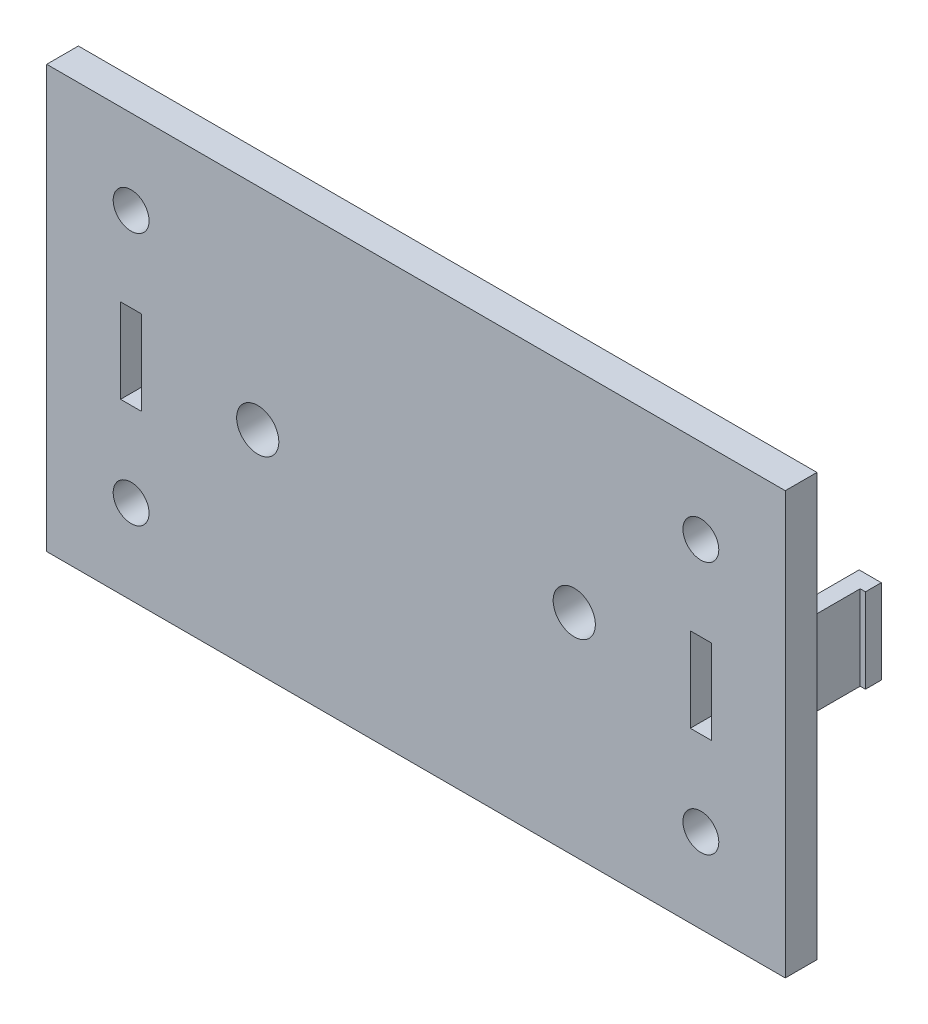
ISO-10303-21;
HEADER;
FILE_DESCRIPTION(('STEP AP214'),'2;1');
FILE_NAME('part.step','',(''),(''),'','','');
FILE_SCHEMA(('AUTOMOTIVE_DESIGN { 1 0 10303 214 1 1 1 1 }'));
ENDSEC;
DATA;
#1=APPLICATION_CONTEXT('core data for automotive mechanical design processes');
#2=APPLICATION_PROTOCOL_DEFINITION('international standard','automotive_design',2000,#1);
#3=PRODUCT_CONTEXT('',#1,'mechanical');
#4=PRODUCT('Part','Part','',(#3));
#5=PRODUCT_RELATED_PRODUCT_CATEGORY('part','',(#4));
#6=PRODUCT_DEFINITION_FORMATION('','',#4);
#7=PRODUCT_DEFINITION_CONTEXT('part definition',#1,'design');
#8=PRODUCT_DEFINITION('design','',#6,#7);
#9=PRODUCT_DEFINITION_SHAPE('','',#8);
#10=(LENGTH_UNIT() NAMED_UNIT(*) SI_UNIT(.MILLI.,.METRE.));
#11=(NAMED_UNIT(*) PLANE_ANGLE_UNIT() SI_UNIT($,.RADIAN.));
#12=(NAMED_UNIT(*) SI_UNIT($,.STERADIAN.) SOLID_ANGLE_UNIT());
#13=UNCERTAINTY_MEASURE_WITH_UNIT(LENGTH_MEASURE(1.E-05),#10,'distance_accuracy_value','');
#14=(GEOMETRIC_REPRESENTATION_CONTEXT(3) GLOBAL_UNCERTAINTY_ASSIGNED_CONTEXT((#13)) GLOBAL_UNIT_ASSIGNED_CONTEXT((#10,
#11,#12)) REPRESENTATION_CONTEXT('',''));
#15=CARTESIAN_POINT('',(0.,0.,0.));
#16=DIRECTION('',(0.,0.,1.));
#17=DIRECTION('',(1.,0.,0.));
#18=AXIS2_PLACEMENT_3D('',#15,#16,#17);
#19=CARTESIAN_POINT('',(0.,0.,0.));
#20=DIRECTION('',(0.,0.,-1.));
#21=DIRECTION('',(-1.,0.,0.));
#22=AXIS2_PLACEMENT_3D('',#19,#20,#21);
#23=PLANE('',#22);
#24=CARTESIAN_POINT('',(27.,12.,0.));
#25=DIRECTION('',(0.,0.,1.));
#26=DIRECTION('',(1.,0.,0.));
#27=AXIS2_PLACEMENT_3D('',#24,#25,#26);
#28=CIRCLE('',#27,1.7);
#29=CARTESIAN_POINT('',(28.7,12.,0.));
#30=VERTEX_POINT('',#29);
#31=EDGE_CURVE('E367',#30,#30,#28,.T.);
#32=ORIENTED_EDGE('',*,*,#31,.T.);
#33=EDGE_LOOP('',(#32));
#34=FACE_BOUND('',#33,.T.);
#35=CARTESIAN_POINT('',(27.,-12.,0.));
#36=DIRECTION('',(0.,0.,1.));
#37=DIRECTION('',(1.,0.,0.));
#38=AXIS2_PLACEMENT_3D('',#35,#36,#37);
#39=CIRCLE('',#38,1.7);
#40=CARTESIAN_POINT('',(28.7,-12.,0.));
#41=VERTEX_POINT('',#40);
#42=EDGE_CURVE('E371',#41,#41,#39,.T.);
#43=ORIENTED_EDGE('',*,*,#42,.T.);
#44=EDGE_LOOP('',(#43));
#45=FACE_BOUND('',#44,.T.);
#46=CARTESIAN_POINT('',(-27.,12.,0.));
#47=DIRECTION('',(0.,0.,1.));
#48=DIRECTION('',(1.,0.,0.));
#49=AXIS2_PLACEMENT_3D('',#46,#47,#48);
#50=CIRCLE('',#49,1.7);
#51=CARTESIAN_POINT('',(-25.3,12.,0.));
#52=VERTEX_POINT('',#51);
#53=EDGE_CURVE('E377',#52,#52,#50,.T.);
#54=ORIENTED_EDGE('',*,*,#53,.T.);
#55=EDGE_LOOP('',(#54));
#56=FACE_BOUND('',#55,.T.);
#57=CARTESIAN_POINT('',(-27.,-12.,0.));
#58=DIRECTION('',(0.,0.,1.));
#59=DIRECTION('',(1.,0.,0.));
#60=AXIS2_PLACEMENT_3D('',#57,#58,#59);
#61=CIRCLE('',#60,1.7);
#62=CARTESIAN_POINT('',(-25.3,-12.,0.));
#63=VERTEX_POINT('',#62);
#64=EDGE_CURVE('E383',#63,#63,#61,.T.);
#65=ORIENTED_EDGE('',*,*,#64,.T.);
#66=EDGE_LOOP('',(#65));
#67=FACE_BOUND('',#66,.T.);
#68=CARTESIAN_POINT('',(15.,0.,0.));
#69=DIRECTION('',(0.,0.,1.));
#70=DIRECTION('',(1.,0.,0.));
#71=AXIS2_PLACEMENT_3D('',#68,#69,#70);
#72=CIRCLE('',#71,2.);
#73=CARTESIAN_POINT('',(17.,0.,0.));
#74=VERTEX_POINT('',#73);
#75=EDGE_CURVE('E389',#74,#74,#72,.T.);
#76=ORIENTED_EDGE('',*,*,#75,.T.);
#77=EDGE_LOOP('',(#76));
#78=FACE_BOUND('',#77,.T.);
#79=CARTESIAN_POINT('',(-15.,0.,0.));
#80=DIRECTION('',(0.,0.,1.));
#81=DIRECTION('',(1.,0.,0.));
#82=AXIS2_PLACEMENT_3D('',#79,#80,#81);
#83=CIRCLE('',#82,2.);
#84=CARTESIAN_POINT('',(-13.,0.,0.));
#85=VERTEX_POINT('',#84);
#86=EDGE_CURVE('E395',#85,#85,#83,.T.);
#87=ORIENTED_EDGE('',*,*,#86,.T.);
#88=EDGE_LOOP('',(#87));
#89=FACE_BOUND('',#88,.T.);
#90=DIRECTION('',(0.,-1.,0.));
#91=VECTOR('',#90,1.);
#92=CARTESIAN_POINT('',(-35.,-20.,0.));
#93=LINE('',#92,#91);
#94=CARTESIAN_POINT('',(-35.,20.,0.));
#95=VERTEX_POINT('',#94);
#96=CARTESIAN_POINT('',(-35.,-20.,0.));
#97=VERTEX_POINT('',#96);
#98=EDGE_CURVE('E401',#95,#97,#93,.T.);
#99=ORIENTED_EDGE('',*,*,#98,.F.);
#100=DIRECTION('',(-1.,0.,0.));
#101=VECTOR('',#100,1.);
#102=CARTESIAN_POINT('',(-35.,20.,0.));
#103=LINE('',#102,#101);
#104=CARTESIAN_POINT('',(35.,20.,0.));
#105=VERTEX_POINT('',#104);
#106=EDGE_CURVE('E408',#105,#95,#103,.T.);
#107=ORIENTED_EDGE('',*,*,#106,.F.);
#108=DIRECTION('',(0.,1.,0.));
#109=VECTOR('',#108,1.);
#110=CARTESIAN_POINT('',(35.,-20.,0.));
#111=LINE('',#110,#109);
#112=CARTESIAN_POINT('',(35.,-20.,0.));
#113=VERTEX_POINT('',#112);
#114=EDGE_CURVE('E419',#113,#105,#111,.T.);
#115=ORIENTED_EDGE('',*,*,#114,.F.);
#116=DIRECTION('',(1.,0.,0.));
#117=VECTOR('',#116,1.);
#118=CARTESIAN_POINT('',(-35.,-20.,0.));
#119=LINE('',#118,#117);
#120=EDGE_CURVE('E417',#97,#113,#119,.T.);
#121=ORIENTED_EDGE('',*,*,#120,.F.);
#122=EDGE_LOOP('',(#99,#107,#115,#121));
#123=FACE_BOUND('',#122,.T.);
#124=DIRECTION('',(-1.,0.,0.));
#125=VECTOR('',#124,1.);
#126=CARTESIAN_POINT('',(-30.6,4.,0.));
#127=LINE('',#126,#125);
#128=CARTESIAN_POINT('',(-29.,4.,0.));
#129=VERTEX_POINT('',#128);
#130=CARTESIAN_POINT('',(-30.6,4.,0.));
#131=VERTEX_POINT('',#130);
#132=EDGE_CURVE('E349',#129,#131,#127,.T.);
#133=ORIENTED_EDGE('',*,*,#132,.T.);
#134=DIRECTION('',(0.,-1.,0.));
#135=VECTOR('',#134,1.);
#136=CARTESIAN_POINT('',(-30.6,-4.,0.));
#137=LINE('',#136,#135);
#138=CARTESIAN_POINT('',(-30.6,-4.,0.));
#139=VERTEX_POINT('',#138);
#140=EDGE_CURVE('E339',#131,#139,#137,.T.);
#141=ORIENTED_EDGE('',*,*,#140,.T.);
#142=DIRECTION('',(1.,0.,0.));
#143=VECTOR('',#142,1.);
#144=CARTESIAN_POINT('',(-30.6,-4.,0.));
#145=LINE('',#144,#143);
#146=CARTESIAN_POINT('',(-29.,-4.,0.));
#147=VERTEX_POINT('',#146);
#148=EDGE_CURVE('E342',#139,#147,#145,.T.);
#149=ORIENTED_EDGE('',*,*,#148,.T.);
#150=DIRECTION('',(0.,1.,0.));
#151=VECTOR('',#150,1.);
#152=CARTESIAN_POINT('',(-29.,-4.,0.));
#153=LINE('',#152,#151);
#154=EDGE_CURVE('E346',#147,#129,#153,.T.);
#155=ORIENTED_EDGE('',*,*,#154,.T.);
#156=EDGE_LOOP('',(#133,#141,#149,#155));
#157=FACE_BOUND('',#156,.T.);
#158=DIRECTION('',(-1.,0.,0.));
#159=VECTOR('',#158,1.);
#160=CARTESIAN_POINT('',(-28.,4.,0.));
#161=LINE('',#160,#159);
#162=CARTESIAN_POINT('',(-26.,4.,0.));
#163=VERTEX_POINT('',#162);
#164=CARTESIAN_POINT('',(-28.,4.,0.));
#165=VERTEX_POINT('',#164);
#166=EDGE_CURVE('E291',#163,#165,#161,.T.);
#167=ORIENTED_EDGE('',*,*,#166,.T.);
#168=DIRECTION('',(0.,-1.,0.));
#169=VECTOR('',#168,1.);
#170=CARTESIAN_POINT('',(-28.,-4.,0.));
#171=LINE('',#170,#169);
#172=CARTESIAN_POINT('',(-28.,-4.,0.));
#173=VERTEX_POINT('',#172);
#174=EDGE_CURVE('E287',#165,#173,#171,.T.);
#175=ORIENTED_EDGE('',*,*,#174,.T.);
#176=DIRECTION('',(1.,0.,0.));
#177=VECTOR('',#176,1.);
#178=CARTESIAN_POINT('',(-28.,-4.,0.));
#179=LINE('',#178,#177);
#180=CARTESIAN_POINT('',(-26.,-4.,0.));
#181=VERTEX_POINT('',#180);
#182=EDGE_CURVE('E301',#173,#181,#179,.T.);
#183=ORIENTED_EDGE('',*,*,#182,.T.);
#184=DIRECTION('',(0.,1.,0.));
#185=VECTOR('',#184,1.);
#186=CARTESIAN_POINT('',(-26.,-4.,0.));
#187=LINE('',#186,#185);
#188=EDGE_CURVE('E304',#181,#163,#187,.T.);
#189=ORIENTED_EDGE('',*,*,#188,.T.);
#190=EDGE_LOOP('',(#167,#175,#183,#189));
#191=FACE_BOUND('',#190,.T.);
#192=DIRECTION('',(-1.,0.,0.));
#193=VECTOR('',#192,1.);
#194=CARTESIAN_POINT('',(29.,4.,0.));
#195=LINE('',#194,#193);
#196=CARTESIAN_POINT('',(30.6,4.,0.));
#197=VERTEX_POINT('',#196);
#198=CARTESIAN_POINT('',(29.,4.,0.));
#199=VERTEX_POINT('',#198);
#200=EDGE_CURVE('E268',#197,#199,#195,.T.);
#201=ORIENTED_EDGE('',*,*,#200,.T.);
#202=DIRECTION('',(0.,-1.,0.));
#203=VECTOR('',#202,1.);
#204=CARTESIAN_POINT('',(29.,-4.,0.));
#205=LINE('',#204,#203);
#206=CARTESIAN_POINT('',(29.,-4.,0.));
#207=VERTEX_POINT('',#206);
#208=EDGE_CURVE('E258',#199,#207,#205,.T.);
#209=ORIENTED_EDGE('',*,*,#208,.T.);
#210=DIRECTION('',(1.,0.,0.));
#211=VECTOR('',#210,1.);
#212=CARTESIAN_POINT('',(29.,-4.,0.));
#213=LINE('',#212,#211);
#214=CARTESIAN_POINT('',(30.6,-4.,0.));
#215=VERTEX_POINT('',#214);
#216=EDGE_CURVE('E261',#207,#215,#213,.T.);
#217=ORIENTED_EDGE('',*,*,#216,.T.);
#218=DIRECTION('',(0.,1.,0.));
#219=VECTOR('',#218,1.);
#220=CARTESIAN_POINT('',(30.6,-4.,0.));
#221=LINE('',#220,#219);
#222=EDGE_CURVE('E265',#215,#197,#221,.T.);
#223=ORIENTED_EDGE('',*,*,#222,.T.);
#224=EDGE_LOOP('',(#201,#209,#217,#223));
#225=FACE_BOUND('',#224,.T.);
#226=DIRECTION('',(-1.,0.,0.));
#227=VECTOR('',#226,1.);
#228=CARTESIAN_POINT('',(26.,4.,0.));
#229=LINE('',#228,#227);
#230=CARTESIAN_POINT('',(28.,4.,0.));
#231=VERTEX_POINT('',#230);
#232=CARTESIAN_POINT('',(26.,4.,0.));
#233=VERTEX_POINT('',#232);
#234=EDGE_CURVE('E211',#231,#233,#229,.T.);
#235=ORIENTED_EDGE('',*,*,#234,.T.);
#236=DIRECTION('',(0.,-1.,0.));
#237=VECTOR('',#236,1.);
#238=CARTESIAN_POINT('',(26.,-4.,0.));
#239=LINE('',#238,#237);
#240=CARTESIAN_POINT('',(26.,-4.,0.));
#241=VERTEX_POINT('',#240);
#242=EDGE_CURVE('E56',#233,#241,#239,.T.);
#243=ORIENTED_EDGE('',*,*,#242,.T.);
#244=DIRECTION('',(1.,0.,0.));
#245=VECTOR('',#244,1.);
#246=CARTESIAN_POINT('',(26.,-4.,0.));
#247=LINE('',#246,#245);
#248=CARTESIAN_POINT('',(28.,-4.,0.));
#249=VERTEX_POINT('',#248);
#250=EDGE_CURVE('E217',#241,#249,#247,.T.);
#251=ORIENTED_EDGE('',*,*,#250,.T.);
#252=DIRECTION('',(0.,1.,0.));
#253=VECTOR('',#252,1.);
#254=CARTESIAN_POINT('',(28.,-4.,0.));
#255=LINE('',#254,#253);
#256=EDGE_CURVE('E231',#249,#231,#255,.T.);
#257=ORIENTED_EDGE('',*,*,#256,.T.);
#258=EDGE_LOOP('',(#235,#243,#251,#257));
#259=FACE_BOUND('',#258,.T.);
#260=ADVANCED_FACE('F41',(#34,#45,#56,#67,#78,#89,#123,#157,#191,#225,#259),#23,.T.);
#261=CARTESIAN_POINT('',(0.,0.,3.));
#262=DIRECTION('',(0.,0.,-1.));
#263=DIRECTION('',(-1.,0.,0.));
#264=AXIS2_PLACEMENT_3D('',#261,#262,#263);
#265=PLANE('',#264);
#266=DIRECTION('',(0.,-1.,0.));
#267=VECTOR('',#266,1.);
#268=CARTESIAN_POINT('',(-28.,-4.,3.));
#269=LINE('',#268,#267);
#270=CARTESIAN_POINT('',(-28.,4.,3.));
#271=VERTEX_POINT('',#270);
#272=CARTESIAN_POINT('',(-28.,-4.,3.));
#273=VERTEX_POINT('',#272);
#274=EDGE_CURVE('E288',#271,#273,#269,.T.);
#275=ORIENTED_EDGE('',*,*,#274,.F.);
#276=DIRECTION('',(-1.,0.,0.));
#277=VECTOR('',#276,1.);
#278=CARTESIAN_POINT('',(-28.,4.,3.));
#279=LINE('',#278,#277);
#280=CARTESIAN_POINT('',(-26.,4.,3.));
#281=VERTEX_POINT('',#280);
#282=EDGE_CURVE('E296',#281,#271,#279,.T.);
#283=ORIENTED_EDGE('',*,*,#282,.F.);
#284=DIRECTION('',(0.,1.,0.));
#285=VECTOR('',#284,1.);
#286=CARTESIAN_POINT('',(-26.,-4.,3.));
#287=LINE('',#286,#285);
#288=CARTESIAN_POINT('',(-26.,-4.,3.));
#289=VERTEX_POINT('',#288);
#290=EDGE_CURVE('E293',#289,#281,#287,.T.);
#291=ORIENTED_EDGE('',*,*,#290,.F.);
#292=DIRECTION('',(1.,0.,0.));
#293=VECTOR('',#292,1.);
#294=CARTESIAN_POINT('',(-28.,-4.,3.));
#295=LINE('',#294,#293);
#296=EDGE_CURVE('E290',#273,#289,#295,.T.);
#297=ORIENTED_EDGE('',*,*,#296,.F.);
#298=EDGE_LOOP('',(#275,#283,#291,#297));
#299=FACE_BOUND('',#298,.T.);
#300=CARTESIAN_POINT('',(27.,12.,3.));
#301=DIRECTION('',(0.,0.,1.));
#302=DIRECTION('',(1.,0.,0.));
#303=AXIS2_PLACEMENT_3D('',#300,#301,#302);
#304=CIRCLE('',#303,1.7);
#305=CARTESIAN_POINT('',(28.7,12.,3.));
#306=VERTEX_POINT('',#305);
#307=EDGE_CURVE('E368',#306,#306,#304,.T.);
#308=ORIENTED_EDGE('',*,*,#307,.F.);
#309=EDGE_LOOP('',(#308));
#310=FACE_BOUND('',#309,.T.);
#311=CARTESIAN_POINT('',(27.,-12.,3.));
#312=DIRECTION('',(0.,0.,1.));
#313=DIRECTION('',(1.,0.,0.));
#314=AXIS2_PLACEMENT_3D('',#311,#312,#313);
#315=CIRCLE('',#314,1.7);
#316=CARTESIAN_POINT('',(28.7,-12.,3.));
#317=VERTEX_POINT('',#316);
#318=EDGE_CURVE('E374',#317,#317,#315,.T.);
#319=ORIENTED_EDGE('',*,*,#318,.F.);
#320=EDGE_LOOP('',(#319));
#321=FACE_BOUND('',#320,.T.);
#322=CARTESIAN_POINT('',(-27.,12.,3.));
#323=DIRECTION('',(0.,0.,1.));
#324=DIRECTION('',(1.,0.,0.));
#325=AXIS2_PLACEMENT_3D('',#322,#323,#324);
#326=CIRCLE('',#325,1.7);
#327=CARTESIAN_POINT('',(-25.3,12.,3.));
#328=VERTEX_POINT('',#327);
#329=EDGE_CURVE('E380',#328,#328,#326,.T.);
#330=ORIENTED_EDGE('',*,*,#329,.F.);
#331=EDGE_LOOP('',(#330));
#332=FACE_BOUND('',#331,.T.);
#333=CARTESIAN_POINT('',(-27.,-12.,3.));
#334=DIRECTION('',(0.,0.,1.));
#335=DIRECTION('',(1.,0.,0.));
#336=AXIS2_PLACEMENT_3D('',#333,#334,#335);
#337=CIRCLE('',#336,1.7);
#338=CARTESIAN_POINT('',(-25.3,-12.,3.));
#339=VERTEX_POINT('',#338);
#340=EDGE_CURVE('E386',#339,#339,#337,.T.);
#341=ORIENTED_EDGE('',*,*,#340,.F.);
#342=EDGE_LOOP('',(#341));
#343=FACE_BOUND('',#342,.T.);
#344=CARTESIAN_POINT('',(15.,0.,3.));
#345=DIRECTION('',(0.,0.,1.));
#346=DIRECTION('',(1.,0.,0.));
#347=AXIS2_PLACEMENT_3D('',#344,#345,#346);
#348=CIRCLE('',#347,2.);
#349=CARTESIAN_POINT('',(17.,0.,3.));
#350=VERTEX_POINT('',#349);
#351=EDGE_CURVE('E392',#350,#350,#348,.T.);
#352=ORIENTED_EDGE('',*,*,#351,.F.);
#353=EDGE_LOOP('',(#352));
#354=FACE_BOUND('',#353,.T.);
#355=CARTESIAN_POINT('',(-15.,0.,3.));
#356=DIRECTION('',(0.,0.,1.));
#357=DIRECTION('',(1.,0.,0.));
#358=AXIS2_PLACEMENT_3D('',#355,#356,#357);
#359=CIRCLE('',#358,2.);
#360=CARTESIAN_POINT('',(-13.,0.,3.));
#361=VERTEX_POINT('',#360);
#362=EDGE_CURVE('E398',#361,#361,#359,.T.);
#363=ORIENTED_EDGE('',*,*,#362,.F.);
#364=EDGE_LOOP('',(#363));
#365=FACE_BOUND('',#364,.T.);
#366=DIRECTION('',(0.,-1.,0.));
#367=VECTOR('',#366,1.);
#368=CARTESIAN_POINT('',(-35.,-20.,3.));
#369=LINE('',#368,#367);
#370=CARTESIAN_POINT('',(-35.,20.,3.));
#371=VERTEX_POINT('',#370);
#372=CARTESIAN_POINT('',(-35.,-20.,3.));
#373=VERTEX_POINT('',#372);
#374=EDGE_CURVE('E404',#371,#373,#369,.T.);
#375=ORIENTED_EDGE('',*,*,#374,.T.);
#376=DIRECTION('',(1.,0.,0.));
#377=VECTOR('',#376,1.);
#378=CARTESIAN_POINT('',(-35.,-20.,3.));
#379=LINE('',#378,#377);
#380=CARTESIAN_POINT('',(35.,-20.,3.));
#381=VERTEX_POINT('',#380);
#382=EDGE_CURVE('E407',#373,#381,#379,.T.);
#383=ORIENTED_EDGE('',*,*,#382,.T.);
#384=DIRECTION('',(0.,1.,0.));
#385=VECTOR('',#384,1.);
#386=CARTESIAN_POINT('',(35.,-20.,3.));
#387=LINE('',#386,#385);
#388=CARTESIAN_POINT('',(35.,20.,3.));
#389=VERTEX_POINT('',#388);
#390=EDGE_CURVE('E410',#381,#389,#387,.T.);
#391=ORIENTED_EDGE('',*,*,#390,.T.);
#392=DIRECTION('',(-1.,0.,0.));
#393=VECTOR('',#392,1.);
#394=CARTESIAN_POINT('',(-35.,20.,3.));
#395=LINE('',#394,#393);
#396=EDGE_CURVE('E412',#389,#371,#395,.T.);
#397=ORIENTED_EDGE('',*,*,#396,.T.);
#398=EDGE_LOOP('',(#375,#383,#391,#397));
#399=FACE_BOUND('',#398,.T.);
#400=DIRECTION('',(0.,-1.,0.));
#401=VECTOR('',#400,1.);
#402=CARTESIAN_POINT('',(26.,-4.,3.));
#403=LINE('',#402,#401);
#404=CARTESIAN_POINT('',(26.,4.,3.));
#405=VERTEX_POINT('',#404);
#406=CARTESIAN_POINT('',(26.,-4.,3.));
#407=VERTEX_POINT('',#406);
#408=EDGE_CURVE('E202',#405,#407,#403,.T.);
#409=ORIENTED_EDGE('',*,*,#408,.F.);
#410=DIRECTION('',(-1.,0.,0.));
#411=VECTOR('',#410,1.);
#412=CARTESIAN_POINT('',(26.,4.,3.));
#413=LINE('',#412,#411);
#414=CARTESIAN_POINT('',(28.,4.,3.));
#415=VERTEX_POINT('',#414);
#416=EDGE_CURVE('E225',#415,#405,#413,.T.);
#417=ORIENTED_EDGE('',*,*,#416,.F.);
#418=DIRECTION('',(0.,1.,0.));
#419=VECTOR('',#418,1.);
#420=CARTESIAN_POINT('',(28.,-4.,3.));
#421=LINE('',#420,#419);
#422=CARTESIAN_POINT('',(28.,-4.,3.));
#423=VERTEX_POINT('',#422);
#424=EDGE_CURVE('E223',#423,#415,#421,.T.);
#425=ORIENTED_EDGE('',*,*,#424,.F.);
#426=DIRECTION('',(1.,0.,0.));
#427=VECTOR('',#426,1.);
#428=CARTESIAN_POINT('',(26.,-4.,3.));
#429=LINE('',#428,#427);
#430=EDGE_CURVE('E210',#407,#423,#429,.T.);
#431=ORIENTED_EDGE('',*,*,#430,.F.);
#432=EDGE_LOOP('',(#409,#417,#425,#431));
#433=FACE_BOUND('',#432,.T.);
#434=ADVANCED_FACE('F222',(#299,#310,#321,#332,#343,#354,#365,#399,#433),#265,.F.);
#435=CARTESIAN_POINT('',(30.6,-4.,0.));
#436=DIRECTION('',(-1.,0.,0.));
#437=DIRECTION('',(0.,0.,1.));
#438=AXIS2_PLACEMENT_3D('',#435,#436,#437);
#439=PLANE('',#438);
#440=DIRECTION('',(0.,-1.,0.));
#441=VECTOR('',#440,1.);
#442=CARTESIAN_POINT('',(30.6,-4.,-8.5));
#443=LINE('',#442,#441);
#444=CARTESIAN_POINT('',(30.6,4.,-8.5));
#445=VERTEX_POINT('',#444);
#446=CARTESIAN_POINT('',(30.6,-4.,-8.5));
#447=VERTEX_POINT('',#446);
#448=EDGE_CURVE('E239',#445,#447,#443,.T.);
#449=ORIENTED_EDGE('',*,*,#448,.F.);
#450=DIRECTION('',(0.,0.,-1.));
#451=VECTOR('',#450,1.);
#452=CARTESIAN_POINT('',(30.6,4.,0.));
#453=LINE('',#452,#451);
#454=EDGE_CURVE('E279',#197,#445,#453,.T.);
#455=ORIENTED_EDGE('',*,*,#454,.F.);
#456=ORIENTED_EDGE('',*,*,#222,.F.);
#457=DIRECTION('',(0.,0.,-1.));
#458=VECTOR('',#457,1.);
#459=CARTESIAN_POINT('',(30.6,-4.,0.));
#460=LINE('',#459,#458);
#461=EDGE_CURVE('E282',#215,#447,#460,.T.);
#462=ORIENTED_EDGE('',*,*,#461,.T.);
#463=EDGE_LOOP('',(#449,#455,#456,#462));
#464=FACE_BOUND('',#463,.T.);
#465=ADVANCED_FACE('F461',(#464),#439,.F.);
#466=CARTESIAN_POINT('',(-30.6,-4.,0.));
#467=DIRECTION('',(1.,0.,0.));
#468=DIRECTION('',(0.,0.,-1.));
#469=AXIS2_PLACEMENT_3D('',#466,#467,#468);
#470=PLANE('',#469);
#471=DIRECTION('',(0.,1.,0.));
#472=VECTOR('',#471,1.);
#473=CARTESIAN_POINT('',(-30.6,-4.,-8.5));
#474=LINE('',#473,#472);
#475=CARTESIAN_POINT('',(-30.6,-4.,-8.5));
#476=VERTEX_POINT('',#475);
#477=CARTESIAN_POINT('',(-30.6,4.,-8.5));
#478=VERTEX_POINT('',#477);
#479=EDGE_CURVE('E325',#476,#478,#474,.T.);
#480=ORIENTED_EDGE('',*,*,#479,.F.);
#481=DIRECTION('',(0.,0.,-1.));
#482=VECTOR('',#481,1.);
#483=CARTESIAN_POINT('',(-30.6,-4.,0.));
#484=LINE('',#483,#482);
#485=EDGE_CURVE('E364',#139,#476,#484,.T.);
#486=ORIENTED_EDGE('',*,*,#485,.F.);
#487=ORIENTED_EDGE('',*,*,#140,.F.);
#488=DIRECTION('',(0.,0.,-1.));
#489=VECTOR('',#488,1.);
#490=CARTESIAN_POINT('',(-30.6,4.,0.));
#491=LINE('',#490,#489);
#492=EDGE_CURVE('E352',#131,#478,#491,.T.);
#493=ORIENTED_EDGE('',*,*,#492,.T.);
#494=EDGE_LOOP('',(#480,#486,#487,#493));
#495=FACE_BOUND('',#494,.T.);
#496=ADVANCED_FACE('F453',(#495),#470,.F.);
#497=CARTESIAN_POINT('',(-35.,-20.,3.));
#498=DIRECTION('',(1.,0.,0.));
#499=DIRECTION('',(0.,0.,-1.));
#500=AXIS2_PLACEMENT_3D('',#497,#498,#499);
#501=PLANE('',#500);
#502=ORIENTED_EDGE('',*,*,#98,.T.);
#503=DIRECTION('',(0.,0.,-1.));
#504=VECTOR('',#503,1.);
#505=CARTESIAN_POINT('',(-35.,-20.,3.));
#506=LINE('',#505,#504);
#507=EDGE_CURVE('E11',#373,#97,#506,.T.);
#508=ORIENTED_EDGE('',*,*,#507,.F.);
#509=ORIENTED_EDGE('',*,*,#374,.F.);
#510=DIRECTION('',(0.,0.,-1.));
#511=VECTOR('',#510,1.);
#512=CARTESIAN_POINT('',(-35.,20.,3.));
#513=LINE('',#512,#511);
#514=EDGE_CURVE('E414',#371,#95,#513,.T.);
#515=ORIENTED_EDGE('',*,*,#514,.T.);
#516=EDGE_LOOP('',(#502,#508,#509,#515));
#517=FACE_BOUND('',#516,.T.);
#518=ADVANCED_FACE('F43',(#517),#501,.F.);
#519=CARTESIAN_POINT('',(-35.,-20.,3.));
#520=DIRECTION('',(0.,1.,0.));
#521=DIRECTION('',(0.,0.,1.));
#522=AXIS2_PLACEMENT_3D('',#519,#520,#521);
#523=PLANE('',#522);
#524=ORIENTED_EDGE('',*,*,#120,.T.);
#525=DIRECTION('',(0.,0.,-1.));
#526=VECTOR('',#525,1.);
#527=CARTESIAN_POINT('',(35.,-20.,3.));
#528=LINE('',#527,#526);
#529=EDGE_CURVE('E49',#381,#113,#528,.T.);
#530=ORIENTED_EDGE('',*,*,#529,.F.);
#531=ORIENTED_EDGE('',*,*,#382,.F.);
#532=ORIENTED_EDGE('',*,*,#507,.T.);
#533=EDGE_LOOP('',(#524,#530,#531,#532));
#534=FACE_BOUND('',#533,.T.);
#535=ADVANCED_FACE('F446',(#534),#523,.F.);
#536=CARTESIAN_POINT('',(35.,-20.,3.));
#537=DIRECTION('',(-1.,0.,0.));
#538=DIRECTION('',(0.,0.,1.));
#539=AXIS2_PLACEMENT_3D('',#536,#537,#538);
#540=PLANE('',#539);
#541=ORIENTED_EDGE('',*,*,#114,.T.);
#542=DIRECTION('',(0.,0.,-1.));
#543=VECTOR('',#542,1.);
#544=CARTESIAN_POINT('',(35.,20.,3.));
#545=LINE('',#544,#543);
#546=EDGE_CURVE('E424',#389,#105,#545,.T.);
#547=ORIENTED_EDGE('',*,*,#546,.F.);
#548=ORIENTED_EDGE('',*,*,#390,.F.);
#549=ORIENTED_EDGE('',*,*,#529,.T.);
#550=EDGE_LOOP('',(#541,#547,#548,#549));
#551=FACE_BOUND('',#550,.T.);
#552=ADVANCED_FACE('F431',(#551),#540,.F.);
#553=CARTESIAN_POINT('',(-35.,20.,3.));
#554=DIRECTION('',(0.,-1.,0.));
#555=DIRECTION('',(0.,0.,-1.));
#556=AXIS2_PLACEMENT_3D('',#553,#554,#555);
#557=PLANE('',#556);
#558=ORIENTED_EDGE('',*,*,#106,.T.);
#559=ORIENTED_EDGE('',*,*,#514,.F.);
#560=ORIENTED_EDGE('',*,*,#396,.F.);
#561=ORIENTED_EDGE('',*,*,#546,.T.);
#562=EDGE_LOOP('',(#558,#559,#560,#561));
#563=FACE_BOUND('',#562,.T.);
#564=ADVANCED_FACE('F440',(#563),#557,.F.);
#565=CARTESIAN_POINT('',(-15.,0.,3.));
#566=DIRECTION('',(0.,0.,-1.));
#567=DIRECTION('',(-1.,0.,0.));
#568=AXIS2_PLACEMENT_3D('',#565,#566,#567);
#569=CYLINDRICAL_SURFACE('',#568,2.);
#570=ORIENTED_EDGE('',*,*,#362,.T.);
#571=EDGE_LOOP('',(#570));
#572=FACE_BOUND('',#571,.T.);
#573=ORIENTED_EDGE('',*,*,#86,.F.);
#574=EDGE_LOOP('',(#573));
#575=FACE_BOUND('',#574,.T.);
#576=ADVANCED_FACE('F468',(#572,#575),#569,.F.);
#577=CARTESIAN_POINT('',(15.,0.,3.));
#578=DIRECTION('',(0.,0.,-1.));
#579=DIRECTION('',(-1.,0.,0.));
#580=AXIS2_PLACEMENT_3D('',#577,#578,#579);
#581=CYLINDRICAL_SURFACE('',#580,2.);
#582=ORIENTED_EDGE('',*,*,#351,.T.);
#583=EDGE_LOOP('',(#582));
#584=FACE_BOUND('',#583,.T.);
#585=ORIENTED_EDGE('',*,*,#75,.F.);
#586=EDGE_LOOP('',(#585));
#587=FACE_BOUND('',#586,.T.);
#588=ADVANCED_FACE('F472',(#584,#587),#581,.F.);
#589=CARTESIAN_POINT('',(-27.,-12.,3.));
#590=DIRECTION('',(0.,0.,-1.));
#591=DIRECTION('',(-1.,0.,0.));
#592=AXIS2_PLACEMENT_3D('',#589,#590,#591);
#593=CYLINDRICAL_SURFACE('',#592,1.7);
#594=ORIENTED_EDGE('',*,*,#340,.T.);
#595=EDGE_LOOP('',(#594));
#596=FACE_BOUND('',#595,.T.);
#597=ORIENTED_EDGE('',*,*,#64,.F.);
#598=EDGE_LOOP('',(#597));
#599=FACE_BOUND('',#598,.T.);
#600=ADVANCED_FACE('F477',(#596,#599),#593,.F.);
#601=CARTESIAN_POINT('',(-27.,12.,3.));
#602=DIRECTION('',(0.,0.,-1.));
#603=DIRECTION('',(-1.,0.,0.));
#604=AXIS2_PLACEMENT_3D('',#601,#602,#603);
#605=CYLINDRICAL_SURFACE('',#604,1.7);
#606=ORIENTED_EDGE('',*,*,#329,.T.);
#607=EDGE_LOOP('',(#606));
#608=FACE_BOUND('',#607,.T.);
#609=ORIENTED_EDGE('',*,*,#53,.F.);
#610=EDGE_LOOP('',(#609));
#611=FACE_BOUND('',#610,.T.);
#612=ADVANCED_FACE('F484',(#608,#611),#605,.F.);
#613=CARTESIAN_POINT('',(27.,-12.,3.));
#614=DIRECTION('',(0.,0.,-1.));
#615=DIRECTION('',(-1.,0.,0.));
#616=AXIS2_PLACEMENT_3D('',#613,#614,#615);
#617=CYLINDRICAL_SURFACE('',#616,1.7);
#618=ORIENTED_EDGE('',*,*,#318,.T.);
#619=EDGE_LOOP('',(#618));
#620=FACE_BOUND('',#619,.T.);
#621=ORIENTED_EDGE('',*,*,#42,.F.);
#622=EDGE_LOOP('',(#621));
#623=FACE_BOUND('',#622,.T.);
#624=ADVANCED_FACE('F488',(#620,#623),#617,.F.);
#625=CARTESIAN_POINT('',(27.,12.,3.));
#626=DIRECTION('',(0.,0.,-1.));
#627=DIRECTION('',(-1.,0.,0.));
#628=AXIS2_PLACEMENT_3D('',#625,#626,#627);
#629=CYLINDRICAL_SURFACE('',#628,1.7);
#630=ORIENTED_EDGE('',*,*,#307,.T.);
#631=EDGE_LOOP('',(#630));
#632=FACE_BOUND('',#631,.T.);
#633=ORIENTED_EDGE('',*,*,#31,.F.);
#634=EDGE_LOOP('',(#633));
#635=FACE_BOUND('',#634,.T.);
#636=ADVANCED_FACE('F492',(#632,#635),#629,.F.);
#637=CARTESIAN_POINT('',(-30.6,-4.,0.));
#638=DIRECTION('',(0.,1.,0.));
#639=DIRECTION('',(0.,0.,1.));
#640=AXIS2_PLACEMENT_3D('',#637,#638,#639);
#641=PLANE('',#640);
#642=DIRECTION('',(1.,0.,0.));
#643=VECTOR('',#642,1.);
#644=CARTESIAN_POINT('',(-30.6,-4.,-10.));
#645=LINE('',#644,#643);
#646=CARTESIAN_POINT('',(-31.1,-4.,-10.));
#647=VERTEX_POINT('',#646);
#648=CARTESIAN_POINT('',(-29.,-4.,-10.));
#649=VERTEX_POINT('',#648);
#650=EDGE_CURVE('E338',#647,#649,#645,.T.);
#651=ORIENTED_EDGE('',*,*,#650,.T.);
#652=DIRECTION('',(0.,0.,-1.));
#653=VECTOR('',#652,1.);
#654=CARTESIAN_POINT('',(-29.,-4.,0.));
#655=LINE('',#654,#653);
#656=EDGE_CURVE('E361',#147,#649,#655,.T.);
#657=ORIENTED_EDGE('',*,*,#656,.F.);
#658=ORIENTED_EDGE('',*,*,#148,.F.);
#659=ORIENTED_EDGE('',*,*,#485,.T.);
#660=DIRECTION('',(1.,0.,0.));
#661=VECTOR('',#660,1.);
#662=CARTESIAN_POINT('',(-31.1,-4.,-8.5));
#663=LINE('',#662,#661);
#664=CARTESIAN_POINT('',(-31.1,-4.,-8.5));
#665=VERTEX_POINT('',#664);
#666=EDGE_CURVE('E322',#665,#476,#663,.T.);
#667=ORIENTED_EDGE('',*,*,#666,.F.);
#668=DIRECTION('',(0.,0.,-1.));
#669=VECTOR('',#668,1.);
#670=CARTESIAN_POINT('',(-31.1,-4.,-8.5));
#671=LINE('',#670,#669);
#672=EDGE_CURVE('E335',#665,#647,#671,.T.);
#673=ORIENTED_EDGE('',*,*,#672,.T.);
#674=EDGE_LOOP('',(#651,#657,#658,#659,#667,#673));
#675=FACE_BOUND('',#674,.T.);
#676=ADVANCED_FACE('F496',(#675),#641,.F.);
#677=CARTESIAN_POINT('',(-29.,-4.,0.));
#678=DIRECTION('',(-1.,0.,0.));
#679=DIRECTION('',(0.,0.,1.));
#680=AXIS2_PLACEMENT_3D('',#677,#678,#679);
#681=PLANE('',#680);
#682=DIRECTION('',(0.,1.,0.));
#683=VECTOR('',#682,1.);
#684=CARTESIAN_POINT('',(-29.,-4.,-10.));
#685=LINE('',#684,#683);
#686=CARTESIAN_POINT('',(-29.,4.,-10.));
#687=VERTEX_POINT('',#686);
#688=EDGE_CURVE('E354',#649,#687,#685,.T.);
#689=ORIENTED_EDGE('',*,*,#688,.T.);
#690=DIRECTION('',(0.,0.,-1.));
#691=VECTOR('',#690,1.);
#692=CARTESIAN_POINT('',(-29.,4.,0.));
#693=LINE('',#692,#691);
#694=EDGE_CURVE('E358',#129,#687,#693,.T.);
#695=ORIENTED_EDGE('',*,*,#694,.F.);
#696=ORIENTED_EDGE('',*,*,#154,.F.);
#697=ORIENTED_EDGE('',*,*,#656,.T.);
#698=EDGE_LOOP('',(#689,#695,#696,#697));
#699=FACE_BOUND('',#698,.T.);
#700=ADVANCED_FACE('F503',(#699),#681,.F.);
#701=CARTESIAN_POINT('',(-30.6,4.,0.));
#702=DIRECTION('',(0.,-1.,0.));
#703=DIRECTION('',(0.,0.,-1.));
#704=AXIS2_PLACEMENT_3D('',#701,#702,#703);
#705=PLANE('',#704);
#706=DIRECTION('',(-1.,0.,0.));
#707=VECTOR('',#706,1.);
#708=CARTESIAN_POINT('',(-30.6,4.,-10.));
#709=LINE('',#708,#707);
#710=CARTESIAN_POINT('',(-31.1,4.,-10.));
#711=VERTEX_POINT('',#710);
#712=EDGE_CURVE('E343',#687,#711,#709,.T.);
#713=ORIENTED_EDGE('',*,*,#712,.T.);
#714=DIRECTION('',(0.,0.,-1.));
#715=VECTOR('',#714,1.);
#716=CARTESIAN_POINT('',(-31.1,4.,-8.5));
#717=LINE('',#716,#715);
#718=CARTESIAN_POINT('',(-31.1,4.,-8.5));
#719=VERTEX_POINT('',#718);
#720=EDGE_CURVE('E330',#719,#711,#717,.T.);
#721=ORIENTED_EDGE('',*,*,#720,.F.);
#722=DIRECTION('',(-1.,0.,0.));
#723=VECTOR('',#722,1.);
#724=CARTESIAN_POINT('',(-31.1,4.,-8.5));
#725=LINE('',#724,#723);
#726=EDGE_CURVE('E328',#478,#719,#725,.T.);
#727=ORIENTED_EDGE('',*,*,#726,.F.);
#728=ORIENTED_EDGE('',*,*,#492,.F.);
#729=ORIENTED_EDGE('',*,*,#132,.F.);
#730=ORIENTED_EDGE('',*,*,#694,.T.);
#731=EDGE_LOOP('',(#713,#721,#727,#728,#729,#730));
#732=FACE_BOUND('',#731,.T.);
#733=ADVANCED_FACE('F507',(#732),#705,.F.);
#734=CARTESIAN_POINT('',(0.,0.,-10.));
#735=DIRECTION('',(0.,0.,-1.));
#736=DIRECTION('',(-1.,0.,0.));
#737=AXIS2_PLACEMENT_3D('',#734,#735,#736);
#738=PLANE('',#737);
#739=ORIENTED_EDGE('',*,*,#650,.F.);
#740=DIRECTION('',(0.,-1.,0.));
#741=VECTOR('',#740,1.);
#742=CARTESIAN_POINT('',(-31.1,-4.,-10.));
#743=LINE('',#742,#741);
#744=EDGE_CURVE('E318',#711,#647,#743,.T.);
#745=ORIENTED_EDGE('',*,*,#744,.F.);
#746=ORIENTED_EDGE('',*,*,#712,.F.);
#747=ORIENTED_EDGE('',*,*,#688,.F.);
#748=EDGE_LOOP('',(#739,#745,#746,#747));
#749=FACE_BOUND('',#748,.T.);
#750=ADVANCED_FACE('F511',(#749),#738,.T.);
#751=CARTESIAN_POINT('',(-31.1,-4.,-8.5));
#752=DIRECTION('',(1.,0.,0.));
#753=DIRECTION('',(0.,0.,-1.));
#754=AXIS2_PLACEMENT_3D('',#751,#752,#753);
#755=PLANE('',#754);
#756=ORIENTED_EDGE('',*,*,#744,.T.);
#757=ORIENTED_EDGE('',*,*,#672,.F.);
#758=DIRECTION('',(0.,-1.,0.));
#759=VECTOR('',#758,1.);
#760=CARTESIAN_POINT('',(-31.1,-4.,-8.5));
#761=LINE('',#760,#759);
#762=EDGE_CURVE('E319',#719,#665,#761,.T.);
#763=ORIENTED_EDGE('',*,*,#762,.F.);
#764=ORIENTED_EDGE('',*,*,#720,.T.);
#765=EDGE_LOOP('',(#756,#757,#763,#764));
#766=FACE_BOUND('',#765,.T.);
#767=ADVANCED_FACE('F515',(#766),#755,.F.);
#768=CARTESIAN_POINT('',(0.,0.,-8.5));
#769=DIRECTION('',(0.,0.,-1.));
#770=DIRECTION('',(-1.,0.,0.));
#771=AXIS2_PLACEMENT_3D('',#768,#769,#770);
#772=PLANE('',#771);
#773=ORIENTED_EDGE('',*,*,#762,.T.);
#774=ORIENTED_EDGE('',*,*,#666,.T.);
#775=ORIENTED_EDGE('',*,*,#479,.T.);
#776=ORIENTED_EDGE('',*,*,#726,.T.);
#777=EDGE_LOOP('',(#773,#774,#775,#776));
#778=FACE_BOUND('',#777,.T.);
#779=ADVANCED_FACE('F519',(#778),#772,.F.);
#780=CARTESIAN_POINT('',(-28.,-4.,3.));
#781=DIRECTION('',(1.,0.,0.));
#782=DIRECTION('',(0.,0.,-1.));
#783=AXIS2_PLACEMENT_3D('',#780,#781,#782);
#784=PLANE('',#783);
#785=ORIENTED_EDGE('',*,*,#174,.F.);
#786=DIRECTION('',(0.,0.,-1.));
#787=VECTOR('',#786,1.);
#788=CARTESIAN_POINT('',(-28.,4.,3.));
#789=LINE('',#788,#787);
#790=EDGE_CURVE('E298',#271,#165,#789,.T.);
#791=ORIENTED_EDGE('',*,*,#790,.F.);
#792=ORIENTED_EDGE('',*,*,#274,.T.);
#793=DIRECTION('',(0.,0.,-1.));
#794=VECTOR('',#793,1.);
#795=CARTESIAN_POINT('',(-28.,-4.,3.));
#796=LINE('',#795,#794);
#797=EDGE_CURVE('E315',#273,#173,#796,.T.);
#798=ORIENTED_EDGE('',*,*,#797,.T.);
#799=EDGE_LOOP('',(#785,#791,#792,#798));
#800=FACE_BOUND('',#799,.T.);
#801=ADVANCED_FACE('F523',(#800),#784,.T.);
#802=CARTESIAN_POINT('',(-28.,-4.,3.));
#803=DIRECTION('',(0.,1.,0.));
#804=DIRECTION('',(0.,0.,1.));
#805=AXIS2_PLACEMENT_3D('',#802,#803,#804);
#806=PLANE('',#805);
#807=ORIENTED_EDGE('',*,*,#182,.F.);
#808=ORIENTED_EDGE('',*,*,#797,.F.);
#809=ORIENTED_EDGE('',*,*,#296,.T.);
#810=DIRECTION('',(0.,0.,-1.));
#811=VECTOR('',#810,1.);
#812=CARTESIAN_POINT('',(-26.,-4.,3.));
#813=LINE('',#812,#811);
#814=EDGE_CURVE('E313',#289,#181,#813,.T.);
#815=ORIENTED_EDGE('',*,*,#814,.T.);
#816=EDGE_LOOP('',(#807,#808,#809,#815));
#817=FACE_BOUND('',#816,.T.);
#818=ADVANCED_FACE('F527',(#817),#806,.T.);
#819=CARTESIAN_POINT('',(-26.,-4.,3.));
#820=DIRECTION('',(-1.,0.,0.));
#821=DIRECTION('',(0.,0.,1.));
#822=AXIS2_PLACEMENT_3D('',#819,#820,#821);
#823=PLANE('',#822);
#824=ORIENTED_EDGE('',*,*,#188,.F.);
#825=ORIENTED_EDGE('',*,*,#814,.F.);
#826=ORIENTED_EDGE('',*,*,#290,.T.);
#827=DIRECTION('',(0.,0.,-1.));
#828=VECTOR('',#827,1.);
#829=CARTESIAN_POINT('',(-26.,4.,3.));
#830=LINE('',#829,#828);
#831=EDGE_CURVE('E311',#281,#163,#830,.T.);
#832=ORIENTED_EDGE('',*,*,#831,.T.);
#833=EDGE_LOOP('',(#824,#825,#826,#832));
#834=FACE_BOUND('',#833,.T.);
#835=ADVANCED_FACE('F531',(#834),#823,.T.);
#836=CARTESIAN_POINT('',(-28.,4.,3.));
#837=DIRECTION('',(0.,-1.,0.));
#838=DIRECTION('',(0.,0.,-1.));
#839=AXIS2_PLACEMENT_3D('',#836,#837,#838);
#840=PLANE('',#839);
#841=ORIENTED_EDGE('',*,*,#166,.F.);
#842=ORIENTED_EDGE('',*,*,#831,.F.);
#843=ORIENTED_EDGE('',*,*,#282,.T.);
#844=ORIENTED_EDGE('',*,*,#790,.T.);
#845=EDGE_LOOP('',(#841,#842,#843,#844));
#846=FACE_BOUND('',#845,.T.);
#847=ADVANCED_FACE('F535',(#846),#840,.T.);
#848=CARTESIAN_POINT('',(29.,-4.,0.));
#849=DIRECTION('',(1.,0.,0.));
#850=DIRECTION('',(0.,0.,-1.));
#851=AXIS2_PLACEMENT_3D('',#848,#849,#850);
#852=PLANE('',#851);
#853=DIRECTION('',(0.,-1.,0.));
#854=VECTOR('',#853,1.);
#855=CARTESIAN_POINT('',(29.,-4.,-10.));
#856=LINE('',#855,#854);
#857=CARTESIAN_POINT('',(29.,4.,-10.));
#858=VERTEX_POINT('',#857);
#859=CARTESIAN_POINT('',(29.,-4.,-10.));
#860=VERTEX_POINT('',#859);
#861=EDGE_CURVE('E257',#858,#860,#856,.T.);
#862=ORIENTED_EDGE('',*,*,#861,.T.);
#863=DIRECTION('',(0.,0.,-1.));
#864=VECTOR('',#863,1.);
#865=CARTESIAN_POINT('',(29.,-4.,0.));
#866=LINE('',#865,#864);
#867=EDGE_CURVE('E284',#207,#860,#866,.T.);
#868=ORIENTED_EDGE('',*,*,#867,.F.);
#869=ORIENTED_EDGE('',*,*,#208,.F.);
#870=DIRECTION('',(0.,0.,-1.));
#871=VECTOR('',#870,1.);
#872=CARTESIAN_POINT('',(29.,4.,0.));
#873=LINE('',#872,#871);
#874=EDGE_CURVE('E271',#199,#858,#873,.T.);
#875=ORIENTED_EDGE('',*,*,#874,.T.);
#876=EDGE_LOOP('',(#862,#868,#869,#875));
#877=FACE_BOUND('',#876,.T.);
#878=ADVANCED_FACE('F539',(#877),#852,.F.);
#879=CARTESIAN_POINT('',(29.,-4.,0.));
#880=DIRECTION('',(0.,1.,0.));
#881=DIRECTION('',(0.,0.,1.));
#882=AXIS2_PLACEMENT_3D('',#879,#880,#881);
#883=PLANE('',#882);
#884=DIRECTION('',(1.,0.,0.));
#885=VECTOR('',#884,1.);
#886=CARTESIAN_POINT('',(29.,-4.,-10.));
#887=LINE('',#886,#885);
#888=CARTESIAN_POINT('',(31.1,-4.,-10.));
#889=VERTEX_POINT('',#888);
#890=EDGE_CURVE('E274',#860,#889,#887,.T.);
#891=ORIENTED_EDGE('',*,*,#890,.T.);
#892=DIRECTION('',(0.,0.,-1.));
#893=VECTOR('',#892,1.);
#894=CARTESIAN_POINT('',(31.1,-4.,-8.5));
#895=LINE('',#894,#893);
#896=CARTESIAN_POINT('',(31.1,-4.,-8.5));
#897=VERTEX_POINT('',#896);
#898=EDGE_CURVE('E254',#897,#889,#895,.T.);
#899=ORIENTED_EDGE('',*,*,#898,.F.);
#900=DIRECTION('',(1.,0.,0.));
#901=VECTOR('',#900,1.);
#902=CARTESIAN_POINT('',(30.6,-4.,-8.5));
#903=LINE('',#902,#901);
#904=EDGE_CURVE('E242',#447,#897,#903,.T.);
#905=ORIENTED_EDGE('',*,*,#904,.F.);
#906=ORIENTED_EDGE('',*,*,#461,.F.);
#907=ORIENTED_EDGE('',*,*,#216,.F.);
#908=ORIENTED_EDGE('',*,*,#867,.T.);
#909=EDGE_LOOP('',(#891,#899,#905,#906,#907,#908));
#910=FACE_BOUND('',#909,.T.);
#911=ADVANCED_FACE('F543',(#910),#883,.F.);
#912=CARTESIAN_POINT('',(29.,4.,0.));
#913=DIRECTION('',(0.,-1.,0.));
#914=DIRECTION('',(0.,0.,-1.));
#915=AXIS2_PLACEMENT_3D('',#912,#913,#914);
#916=PLANE('',#915);
#917=DIRECTION('',(-1.,0.,0.));
#918=VECTOR('',#917,1.);
#919=CARTESIAN_POINT('',(29.,4.,-10.));
#920=LINE('',#919,#918);
#921=CARTESIAN_POINT('',(31.1,4.,-10.));
#922=VERTEX_POINT('',#921);
#923=EDGE_CURVE('E262',#922,#858,#920,.T.);
#924=ORIENTED_EDGE('',*,*,#923,.T.);
#925=ORIENTED_EDGE('',*,*,#874,.F.);
#926=ORIENTED_EDGE('',*,*,#200,.F.);
#927=ORIENTED_EDGE('',*,*,#454,.T.);
#928=DIRECTION('',(-1.,0.,0.));
#929=VECTOR('',#928,1.);
#930=CARTESIAN_POINT('',(30.6,4.,-8.5));
#931=LINE('',#930,#929);
#932=CARTESIAN_POINT('',(31.1,4.,-8.5));
#933=VERTEX_POINT('',#932);
#934=EDGE_CURVE('E246',#933,#445,#931,.T.);
#935=ORIENTED_EDGE('',*,*,#934,.F.);
#936=DIRECTION('',(0.,0.,-1.));
#937=VECTOR('',#936,1.);
#938=CARTESIAN_POINT('',(31.1,4.,-8.5));
#939=LINE('',#938,#937);
#940=EDGE_CURVE('E249',#933,#922,#939,.T.);
#941=ORIENTED_EDGE('',*,*,#940,.T.);
#942=EDGE_LOOP('',(#924,#925,#926,#927,#935,#941));
#943=FACE_BOUND('',#942,.T.);
#944=ADVANCED_FACE('F547',(#943),#916,.F.);
#945=CARTESIAN_POINT('',(0.,0.,-10.));
#946=DIRECTION('',(0.,0.,-1.));
#947=DIRECTION('',(-1.,0.,0.));
#948=AXIS2_PLACEMENT_3D('',#945,#946,#947);
#949=PLANE('',#948);
#950=ORIENTED_EDGE('',*,*,#861,.F.);
#951=ORIENTED_EDGE('',*,*,#923,.F.);
#952=DIRECTION('',(0.,1.,0.));
#953=VECTOR('',#952,1.);
#954=CARTESIAN_POINT('',(31.1,-4.,-10.));
#955=LINE('',#954,#953);
#956=EDGE_CURVE('E218',#889,#922,#955,.T.);
#957=ORIENTED_EDGE('',*,*,#956,.F.);
#958=ORIENTED_EDGE('',*,*,#890,.F.);
#959=EDGE_LOOP('',(#950,#951,#957,#958));
#960=FACE_BOUND('',#959,.T.);
#961=ADVANCED_FACE('F554',(#960),#949,.T.);
#962=CARTESIAN_POINT('',(31.1,-4.,-8.5));
#963=DIRECTION('',(-1.,0.,0.));
#964=DIRECTION('',(0.,0.,1.));
#965=AXIS2_PLACEMENT_3D('',#962,#963,#964);
#966=PLANE('',#965);
#967=ORIENTED_EDGE('',*,*,#956,.T.);
#968=ORIENTED_EDGE('',*,*,#940,.F.);
#969=DIRECTION('',(0.,1.,0.));
#970=VECTOR('',#969,1.);
#971=CARTESIAN_POINT('',(31.1,-4.,-8.5));
#972=LINE('',#971,#970);
#973=EDGE_CURVE('E244',#897,#933,#972,.T.);
#974=ORIENTED_EDGE('',*,*,#973,.F.);
#975=ORIENTED_EDGE('',*,*,#898,.T.);
#976=EDGE_LOOP('',(#967,#968,#974,#975));
#977=FACE_BOUND('',#976,.T.);
#978=ADVANCED_FACE('F558',(#977),#966,.F.);
#979=CARTESIAN_POINT('',(0.,0.,-8.5));
#980=DIRECTION('',(0.,0.,-1.));
#981=DIRECTION('',(-1.,0.,0.));
#982=AXIS2_PLACEMENT_3D('',#979,#980,#981);
#983=PLANE('',#982);
#984=ORIENTED_EDGE('',*,*,#448,.T.);
#985=ORIENTED_EDGE('',*,*,#904,.T.);
#986=ORIENTED_EDGE('',*,*,#973,.T.);
#987=ORIENTED_EDGE('',*,*,#934,.T.);
#988=EDGE_LOOP('',(#984,#985,#986,#987));
#989=FACE_BOUND('',#988,.T.);
#990=ADVANCED_FACE('F562',(#989),#983,.F.);
#991=CARTESIAN_POINT('',(26.,-4.,3.));
#992=DIRECTION('',(1.,0.,0.));
#993=DIRECTION('',(0.,0.,-1.));
#994=AXIS2_PLACEMENT_3D('',#991,#992,#993);
#995=PLANE('',#994);
#996=ORIENTED_EDGE('',*,*,#242,.F.);
#997=DIRECTION('',(0.,0.,-1.));
#998=VECTOR('',#997,1.);
#999=CARTESIAN_POINT('',(26.,4.,3.));
#1000=LINE('',#999,#998);
#1001=EDGE_CURVE('E206',#405,#233,#1000,.T.);
#1002=ORIENTED_EDGE('',*,*,#1001,.F.);
#1003=ORIENTED_EDGE('',*,*,#408,.T.);
#1004=DIRECTION('',(0.,0.,-1.));
#1005=VECTOR('',#1004,1.);
#1006=CARTESIAN_POINT('',(26.,-4.,3.));
#1007=LINE('',#1006,#1005);
#1008=EDGE_CURVE('E205',#407,#241,#1007,.T.);
#1009=ORIENTED_EDGE('',*,*,#1008,.T.);
#1010=EDGE_LOOP('',(#996,#1002,#1003,#1009));
#1011=FACE_BOUND('',#1010,.T.);
#1012=ADVANCED_FACE('F204',(#1011),#995,.T.);
#1013=CARTESIAN_POINT('',(26.,-4.,3.));
#1014=DIRECTION('',(0.,1.,0.));
#1015=DIRECTION('',(0.,0.,1.));
#1016=AXIS2_PLACEMENT_3D('',#1013,#1014,#1015);
#1017=PLANE('',#1016);
#1018=ORIENTED_EDGE('',*,*,#250,.F.);
#1019=ORIENTED_EDGE('',*,*,#1008,.F.);
#1020=ORIENTED_EDGE('',*,*,#430,.T.);
#1021=DIRECTION('',(0.,0.,-1.));
#1022=VECTOR('',#1021,1.);
#1023=CARTESIAN_POINT('',(28.,-4.,3.));
#1024=LINE('',#1023,#1022);
#1025=EDGE_CURVE('E219',#423,#249,#1024,.T.);
#1026=ORIENTED_EDGE('',*,*,#1025,.T.);
#1027=EDGE_LOOP('',(#1018,#1019,#1020,#1026));
#1028=FACE_BOUND('',#1027,.T.);
#1029=ADVANCED_FACE('F214',(#1028),#1017,.T.);
#1030=CARTESIAN_POINT('',(28.,-4.,3.));
#1031=DIRECTION('',(-1.,0.,0.));
#1032=DIRECTION('',(0.,0.,1.));
#1033=AXIS2_PLACEMENT_3D('',#1030,#1031,#1032);
#1034=PLANE('',#1033);
#1035=ORIENTED_EDGE('',*,*,#256,.F.);
#1036=ORIENTED_EDGE('',*,*,#1025,.F.);
#1037=ORIENTED_EDGE('',*,*,#424,.T.);
#1038=DIRECTION('',(0.,0.,-1.));
#1039=VECTOR('',#1038,1.);
#1040=CARTESIAN_POINT('',(28.,4.,3.));
#1041=LINE('',#1040,#1039);
#1042=EDGE_CURVE('E64',#415,#231,#1041,.T.);
#1043=ORIENTED_EDGE('',*,*,#1042,.T.);
#1044=EDGE_LOOP('',(#1035,#1036,#1037,#1043));
#1045=FACE_BOUND('',#1044,.T.);
#1046=ADVANCED_FACE('F570',(#1045),#1034,.T.);
#1047=CARTESIAN_POINT('',(26.,4.,3.));
#1048=DIRECTION('',(0.,-1.,0.));
#1049=DIRECTION('',(0.,0.,-1.));
#1050=AXIS2_PLACEMENT_3D('',#1047,#1048,#1049);
#1051=PLANE('',#1050);
#1052=ORIENTED_EDGE('',*,*,#234,.F.);
#1053=ORIENTED_EDGE('',*,*,#1042,.F.);
#1054=ORIENTED_EDGE('',*,*,#416,.T.);
#1055=ORIENTED_EDGE('',*,*,#1001,.T.);
#1056=EDGE_LOOP('',(#1052,#1053,#1054,#1055));
#1057=FACE_BOUND('',#1056,.T.);
#1058=ADVANCED_FACE('F573',(#1057),#1051,.T.);
#1059=CLOSED_SHELL('',(#260,#434,#465,#496,#518,#535,#552,#564,#576,#588,#600,#612,#624,#636,
#676,#700,#733,#750,#767,#779,#801,#818,#835,#847,#878,#911,#944,#961,#978,#990,#1012,#1029,
#1046,#1058));
#1060=MANIFOLD_SOLID_BREP('B2',#1059);
#1061=ADVANCED_BREP_SHAPE_REPRESENTATION('',(#18,#1060),#14);
#1062=SHAPE_DEFINITION_REPRESENTATION(#9,#1061);
ENDSEC;
END-ISO-10303-21;
